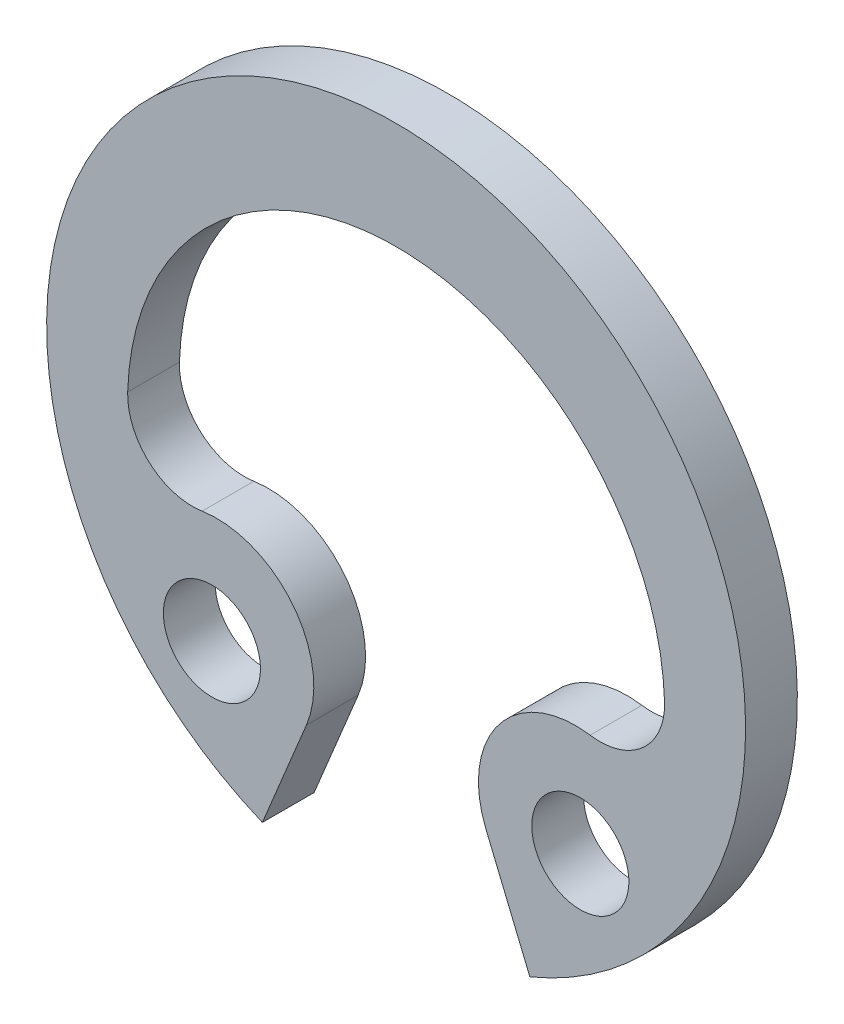
ISO-10303-21;
HEADER;
FILE_DESCRIPTION(('STEP AP214'),'2;1');
FILE_NAME('part.step','',(''),(''),'','','');
FILE_SCHEMA(('AUTOMOTIVE_DESIGN { 1 0 10303 214 1 1 1 1 }'));
ENDSEC;
DATA;
#1=APPLICATION_CONTEXT('core data for automotive mechanical design processes');
#2=APPLICATION_PROTOCOL_DEFINITION('international standard','automotive_design',2000,#1);
#3=PRODUCT_CONTEXT('',#1,'mechanical');
#4=PRODUCT('Part','Part','',(#3));
#5=PRODUCT_RELATED_PRODUCT_CATEGORY('part','',(#4));
#6=PRODUCT_DEFINITION_FORMATION('','',#4);
#7=PRODUCT_DEFINITION_CONTEXT('part definition',#1,'design');
#8=PRODUCT_DEFINITION('design','',#6,#7);
#9=PRODUCT_DEFINITION_SHAPE('','',#8);
#10=(LENGTH_UNIT() NAMED_UNIT(*) SI_UNIT(.MILLI.,.METRE.));
#11=(NAMED_UNIT(*) PLANE_ANGLE_UNIT() SI_UNIT($,.RADIAN.));
#12=(NAMED_UNIT(*) SI_UNIT($,.STERADIAN.) SOLID_ANGLE_UNIT());
#13=UNCERTAINTY_MEASURE_WITH_UNIT(LENGTH_MEASURE(1.E-05),#10,'distance_accuracy_value','');
#14=(GEOMETRIC_REPRESENTATION_CONTEXT(3) GLOBAL_UNCERTAINTY_ASSIGNED_CONTEXT((#13)) GLOBAL_UNIT_ASSIGNED_CONTEXT((#10,
#11,#12)) REPRESENTATION_CONTEXT('',''));
#15=CARTESIAN_POINT('',(0.,0.,0.));
#16=DIRECTION('',(0.,0.,1.));
#17=DIRECTION('',(1.,0.,0.));
#18=AXIS2_PLACEMENT_3D('',#15,#16,#17);
#19=CARTESIAN_POINT('',(-2.77176746072047,-2.77194970078665,0.8));
#20=DIRECTION('',(0.,0.,1.));
#21=DIRECTION('',(1.,0.,0.));
#22=AXIS2_PLACEMENT_3D('',#19,#20,#21);
#23=PLANE('',#22);
#24=CARTESIAN_POINT('',(-2.84604621023033,-2.95127446524947,0.8));
#25=DIRECTION('',(0.,0.,1.));
#26=DIRECTION('',(1.,0.,0.));
#27=AXIS2_PLACEMENT_3D('',#24,#25,#26);
#28=CIRCLE('',#27,0.75);
#29=CARTESIAN_POINT('',(-2.09604621023033,-2.95127446524947,0.8));
#30=VERTEX_POINT('',#29);
#31=EDGE_CURVE('E143',#30,#30,#28,.T.);
#32=ORIENTED_EDGE('',*,*,#31,.F.);
#33=EDGE_LOOP('',(#32));
#34=FACE_BOUND('',#33,.T.);
#35=CARTESIAN_POINT('',(-2.77176746072047,-2.77194970078665,0.8));
#36=DIRECTION('',(0.,0.,1.));
#37=DIRECTION('',(1.,0.,0.));
#38=AXIS2_PLACEMENT_3D('',#35,#36,#37);
#39=CIRCLE('',#38,1.5);
#40=CARTESIAN_POINT('',(-1.38594816195354,-3.34597484933429,0.8));
#41=VERTEX_POINT('',#40);
#42=CARTESIAN_POINT('',(-2.99776362474062,-1.2890721826321,0.8));
#43=VERTEX_POINT('',#42);
#44=EDGE_CURVE('E156',#41,#43,#39,.T.);
#45=ORIENTED_EDGE('',*,*,#44,.T.);
#46=CARTESIAN_POINT('',(-3.14842773408739,-0.300487170529072,0.8));
#47=DIRECTION('',(0.,0.,-1.));
#48=DIRECTION('',(-1.,0.,0.));
#49=AXIS2_PLACEMENT_3D('',#46,#47,#48);
#50=CIRCLE('',#49,1.);
#51=CARTESIAN_POINT('',(-4.14792860205164,-0.268895796093855,0.8));
#52=VERTEX_POINT('',#51);
#53=EDGE_CURVE('E102',#43,#52,#50,.T.);
#54=ORIENTED_EDGE('',*,*,#53,.T.);
#55=CARTESIAN_POINT('',(0.,-0.4,0.8));
#56=DIRECTION('',(0.,0.,-1.));
#57=DIRECTION('',(1.,0.,0.));
#58=AXIS2_PLACEMENT_3D('',#55,#56,#57);
#59=CIRCLE('',#58,4.15);
#60=CARTESIAN_POINT('',(4.14792860205165,-0.268895796093856,0.8));
#61=VERTEX_POINT('',#60);
#62=EDGE_CURVE('E171',#52,#61,#59,.T.);
#63=ORIENTED_EDGE('',*,*,#62,.T.);
#64=CARTESIAN_POINT('',(3.1484277340874,-0.300487170529072,0.8));
#65=DIRECTION('',(0.,0.,-1.));
#66=DIRECTION('',(1.,0.,0.));
#67=AXIS2_PLACEMENT_3D('',#64,#65,#66);
#68=CIRCLE('',#67,1.);
#69=CARTESIAN_POINT('',(2.99776362474063,-1.2890721826321,0.8));
#70=VERTEX_POINT('',#69);
#71=EDGE_CURVE('E184',#61,#70,#68,.T.);
#72=ORIENTED_EDGE('',*,*,#71,.T.);
#73=CARTESIAN_POINT('',(2.77176746072048,-2.77194970078665,0.8));
#74=DIRECTION('',(0.,0.,1.));
#75=DIRECTION('',(-1.,0.,0.));
#76=AXIS2_PLACEMENT_3D('',#73,#74,#75);
#77=CIRCLE('',#76,1.5);
#78=CARTESIAN_POINT('',(1.38594816195355,-3.34597484933429,0.8));
#79=VERTEX_POINT('',#78);
#80=EDGE_CURVE('E121',#70,#79,#77,.T.);
#81=ORIENTED_EDGE('',*,*,#80,.T.);
#82=DIRECTION('',(0.38268343236509,-0.923879532511287,0.));
#83=VECTOR('',#82,1.);
#84=CARTESIAN_POINT('',(1.38594816195355,-3.34597484933429,0.8));
#85=LINE('',#84,#83);
#86=CARTESIAN_POINT('',(2.0664905347715,-4.98894947556095,0.8));
#87=VERTEX_POINT('',#86);
#88=EDGE_CURVE('E115',#79,#87,#85,.T.);
#89=ORIENTED_EDGE('',*,*,#88,.T.);
#90=CARTESIAN_POINT('',(0.,0.,0.8));
#91=DIRECTION('',(0.,0.,1.));
#92=DIRECTION('',(1.,0.,0.));
#93=AXIS2_PLACEMENT_3D('',#90,#91,#92);
#94=CIRCLE('',#93,5.40000000000001);
#95=CARTESIAN_POINT('',(-2.06649053477149,-4.98894947556095,0.8));
#96=VERTEX_POINT('',#95);
#97=EDGE_CURVE('E119',#87,#96,#94,.T.);
#98=ORIENTED_EDGE('',*,*,#97,.T.);
#99=DIRECTION('',(0.38268343236509,0.923879532511287,0.));
#100=VECTOR('',#99,1.);
#101=CARTESIAN_POINT('',(-1.38594816195354,-3.34597484933429,0.8));
#102=LINE('',#101,#100);
#103=EDGE_CURVE('E59',#96,#41,#102,.T.);
#104=ORIENTED_EDGE('',*,*,#103,.T.);
#105=EDGE_LOOP('',(#45,#54,#63,#72,#81,#89,#98,#104));
#106=FACE_BOUND('',#105,.T.);
#107=CARTESIAN_POINT('',(2.84604621023034,-2.95127446524947,0.8));
#108=DIRECTION('',(0.,0.,1.));
#109=DIRECTION('',(-1.,0.,0.));
#110=AXIS2_PLACEMENT_3D('',#107,#108,#109);
#111=CIRCLE('',#110,0.75);
#112=CARTESIAN_POINT('',(2.09604621023034,-2.95127446524947,0.8));
#113=VERTEX_POINT('',#112);
#114=EDGE_CURVE('E194',#113,#113,#111,.T.);
#115=ORIENTED_EDGE('',*,*,#114,.F.);
#116=EDGE_LOOP('',(#115));
#117=FACE_BOUND('',#116,.T.);
#118=ADVANCED_FACE('F42',(#34,#106,#117),#23,.T.);
#119=CARTESIAN_POINT('',(-2.77176746072047,-2.77194970078665,0.));
#120=DIRECTION('',(0.,0.,1.));
#121=DIRECTION('',(1.,0.,0.));
#122=AXIS2_PLACEMENT_3D('',#119,#120,#121);
#123=PLANE('',#122);
#124=CARTESIAN_POINT('',(-2.77176746072047,-2.77194970078665,0.));
#125=DIRECTION('',(0.,0.,1.));
#126=DIRECTION('',(1.,0.,0.));
#127=AXIS2_PLACEMENT_3D('',#124,#125,#126);
#128=CIRCLE('',#127,1.5);
#129=CARTESIAN_POINT('',(-1.38594816195354,-3.34597484933429,0.));
#130=VERTEX_POINT('',#129);
#131=CARTESIAN_POINT('',(-2.99776362474062,-1.2890721826321,0.));
#132=VERTEX_POINT('',#131);
#133=EDGE_CURVE('E139',#130,#132,#128,.T.);
#134=ORIENTED_EDGE('',*,*,#133,.F.);
#135=DIRECTION('',(0.38268343236509,0.923879532511287,0.));
#136=VECTOR('',#135,1.);
#137=CARTESIAN_POINT('',(-1.38594816195354,-3.34597484933429,0.));
#138=LINE('',#137,#136);
#139=CARTESIAN_POINT('',(-2.06649053477149,-4.98894947556095,0.));
#140=VERTEX_POINT('',#139);
#141=EDGE_CURVE('E94',#140,#130,#138,.T.);
#142=ORIENTED_EDGE('',*,*,#141,.F.);
#143=CARTESIAN_POINT('',(0.,0.,0.));
#144=DIRECTION('',(0.,0.,1.));
#145=DIRECTION('',(1.,0.,0.));
#146=AXIS2_PLACEMENT_3D('',#143,#144,#145);
#147=CIRCLE('',#146,5.40000000000001);
#148=CARTESIAN_POINT('',(2.0664905347715,-4.98894947556095,0.));
#149=VERTEX_POINT('',#148);
#150=EDGE_CURVE('E88',#149,#140,#147,.T.);
#151=ORIENTED_EDGE('',*,*,#150,.F.);
#152=DIRECTION('',(0.38268343236509,-0.923879532511287,0.));
#153=VECTOR('',#152,1.);
#154=CARTESIAN_POINT('',(1.38594816195355,-3.34597484933429,0.));
#155=LINE('',#154,#153);
#156=CARTESIAN_POINT('',(1.38594816195355,-3.34597484933429,0.));
#157=VERTEX_POINT('',#156);
#158=EDGE_CURVE('E129',#157,#149,#155,.T.);
#159=ORIENTED_EDGE('',*,*,#158,.F.);
#160=CARTESIAN_POINT('',(2.77176746072048,-2.77194970078665,0.));
#161=DIRECTION('',(0.,0.,1.));
#162=DIRECTION('',(-1.,0.,0.));
#163=AXIS2_PLACEMENT_3D('',#160,#161,#162);
#164=CIRCLE('',#163,1.5);
#165=CARTESIAN_POINT('',(2.99776362474063,-1.2890721826321,0.));
#166=VERTEX_POINT('',#165);
#167=EDGE_CURVE('E150',#166,#157,#164,.T.);
#168=ORIENTED_EDGE('',*,*,#167,.F.);
#169=CARTESIAN_POINT('',(3.1484277340874,-0.300487170529072,0.));
#170=DIRECTION('',(0.,0.,-1.));
#171=DIRECTION('',(1.,0.,0.));
#172=AXIS2_PLACEMENT_3D('',#169,#170,#171);
#173=CIRCLE('',#172,1.);
#174=CARTESIAN_POINT('',(4.14792860205165,-0.268895796093856,0.));
#175=VERTEX_POINT('',#174);
#176=EDGE_CURVE('E148',#175,#166,#173,.T.);
#177=ORIENTED_EDGE('',*,*,#176,.F.);
#178=CARTESIAN_POINT('',(0.,-0.4,0.));
#179=DIRECTION('',(0.,0.,-1.));
#180=DIRECTION('',(1.,0.,0.));
#181=AXIS2_PLACEMENT_3D('',#178,#179,#180);
#182=CIRCLE('',#181,4.15);
#183=CARTESIAN_POINT('',(-4.14792860205164,-0.268895796093855,0.));
#184=VERTEX_POINT('',#183);
#185=EDGE_CURVE('E145',#184,#175,#182,.T.);
#186=ORIENTED_EDGE('',*,*,#185,.F.);
#187=CARTESIAN_POINT('',(-3.14842773408739,-0.300487170529072,0.));
#188=DIRECTION('',(0.,0.,-1.));
#189=DIRECTION('',(-1.,0.,0.));
#190=AXIS2_PLACEMENT_3D('',#187,#188,#189);
#191=CIRCLE('',#190,1.);
#192=EDGE_CURVE('E142',#132,#184,#191,.T.);
#193=ORIENTED_EDGE('',*,*,#192,.F.);
#194=EDGE_LOOP('',(#134,#142,#151,#159,#168,#177,#186,#193));
#195=FACE_BOUND('',#194,.T.);
#196=CARTESIAN_POINT('',(-2.84604621023033,-2.95127446524947,0.));
#197=DIRECTION('',(0.,0.,1.));
#198=DIRECTION('',(1.,0.,0.));
#199=AXIS2_PLACEMENT_3D('',#196,#197,#198);
#200=CIRCLE('',#199,0.75);
#201=CARTESIAN_POINT('',(-2.09604621023033,-2.95127446524947,0.));
#202=VERTEX_POINT('',#201);
#203=EDGE_CURVE('E191',#202,#202,#200,.T.);
#204=ORIENTED_EDGE('',*,*,#203,.T.);
#205=EDGE_LOOP('',(#204));
#206=FACE_BOUND('',#205,.T.);
#207=CARTESIAN_POINT('',(2.84604621023034,-2.95127446524947,0.));
#208=DIRECTION('',(0.,0.,1.));
#209=DIRECTION('',(-1.,0.,0.));
#210=AXIS2_PLACEMENT_3D('',#207,#208,#209);
#211=CIRCLE('',#210,0.75);
#212=CARTESIAN_POINT('',(2.09604621023034,-2.95127446524947,0.));
#213=VERTEX_POINT('',#212);
#214=EDGE_CURVE('E197',#213,#213,#211,.T.);
#215=ORIENTED_EDGE('',*,*,#214,.T.);
#216=EDGE_LOOP('',(#215));
#217=FACE_BOUND('',#216,.T.);
#218=ADVANCED_FACE('F175',(#195,#206,#217),#123,.F.);
#219=CARTESIAN_POINT('',(-2.77176746072047,-2.77194970078665,0.8));
#220=DIRECTION('',(0.,0.,-1.));
#221=DIRECTION('',(-1.,0.,0.));
#222=AXIS2_PLACEMENT_3D('',#219,#220,#221);
#223=CYLINDRICAL_SURFACE('',#222,1.5);
#224=ORIENTED_EDGE('',*,*,#133,.T.);
#225=DIRECTION('',(0.,0.,-1.));
#226=VECTOR('',#225,1.);
#227=CARTESIAN_POINT('',(-2.99776362474062,-1.2890721826321,0.8));
#228=LINE('',#227,#226);
#229=EDGE_CURVE('E11',#43,#132,#228,.T.);
#230=ORIENTED_EDGE('',*,*,#229,.F.);
#231=ORIENTED_EDGE('',*,*,#44,.F.);
#232=DIRECTION('',(0.,0.,-1.));
#233=VECTOR('',#232,1.);
#234=CARTESIAN_POINT('',(-1.38594816195354,-3.34597484933429,0.8));
#235=LINE('',#234,#233);
#236=EDGE_CURVE('E135',#41,#130,#235,.T.);
#237=ORIENTED_EDGE('',*,*,#236,.T.);
#238=EDGE_LOOP('',(#224,#230,#231,#237));
#239=FACE_BOUND('',#238,.T.);
#240=ADVANCED_FACE('F44',(#239),#223,.T.);
#241=CARTESIAN_POINT('',(-3.14842773408739,-0.300487170529072,0.8));
#242=DIRECTION('',(0.,0.,-1.));
#243=DIRECTION('',(-1.,0.,0.));
#244=AXIS2_PLACEMENT_3D('',#241,#242,#243);
#245=CYLINDRICAL_SURFACE('',#244,1.);
#246=ORIENTED_EDGE('',*,*,#192,.T.);
#247=DIRECTION('',(0.,0.,-1.));
#248=VECTOR('',#247,1.);
#249=CARTESIAN_POINT('',(-4.14792860205164,-0.268895796093855,0.8));
#250=LINE('',#249,#248);
#251=EDGE_CURVE('E51',#52,#184,#250,.T.);
#252=ORIENTED_EDGE('',*,*,#251,.F.);
#253=ORIENTED_EDGE('',*,*,#53,.F.);
#254=ORIENTED_EDGE('',*,*,#229,.T.);
#255=EDGE_LOOP('',(#246,#252,#253,#254));
#256=FACE_BOUND('',#255,.T.);
#257=ADVANCED_FACE('F229',(#256),#245,.F.);
#258=CARTESIAN_POINT('',(0.,-0.4,0.8));
#259=DIRECTION('',(0.,0.,-1.));
#260=DIRECTION('',(-1.,0.,0.));
#261=AXIS2_PLACEMENT_3D('',#258,#259,#260);
#262=CYLINDRICAL_SURFACE('',#261,4.15);
#263=ORIENTED_EDGE('',*,*,#185,.T.);
#264=DIRECTION('',(0.,0.,-1.));
#265=VECTOR('',#264,1.);
#266=CARTESIAN_POINT('',(4.14792860205165,-0.268895796093856,0.8));
#267=LINE('',#266,#265);
#268=EDGE_CURVE('E163',#61,#175,#267,.T.);
#269=ORIENTED_EDGE('',*,*,#268,.F.);
#270=ORIENTED_EDGE('',*,*,#62,.F.);
#271=ORIENTED_EDGE('',*,*,#251,.T.);
#272=EDGE_LOOP('',(#263,#269,#270,#271));
#273=FACE_BOUND('',#272,.T.);
#274=ADVANCED_FACE('F169',(#273),#262,.F.);
#275=CARTESIAN_POINT('',(3.1484277340874,-0.300487170529072,0.8));
#276=DIRECTION('',(0.,0.,-1.));
#277=DIRECTION('',(-1.,0.,0.));
#278=AXIS2_PLACEMENT_3D('',#275,#276,#277);
#279=CYLINDRICAL_SURFACE('',#278,1.);
#280=ORIENTED_EDGE('',*,*,#176,.T.);
#281=DIRECTION('',(0.,0.,-1.));
#282=VECTOR('',#281,1.);
#283=CARTESIAN_POINT('',(2.99776362474063,-1.2890721826321,0.8));
#284=LINE('',#283,#282);
#285=EDGE_CURVE('E160',#70,#166,#284,.T.);
#286=ORIENTED_EDGE('',*,*,#285,.F.);
#287=ORIENTED_EDGE('',*,*,#71,.F.);
#288=ORIENTED_EDGE('',*,*,#268,.T.);
#289=EDGE_LOOP('',(#280,#286,#287,#288));
#290=FACE_BOUND('',#289,.T.);
#291=ADVANCED_FACE('F180',(#290),#279,.F.);
#292=CARTESIAN_POINT('',(2.77176746072048,-2.77194970078665,0.8));
#293=DIRECTION('',(0.,0.,-1.));
#294=DIRECTION('',(-1.,0.,0.));
#295=AXIS2_PLACEMENT_3D('',#292,#293,#294);
#296=CYLINDRICAL_SURFACE('',#295,1.5);
#297=ORIENTED_EDGE('',*,*,#167,.T.);
#298=DIRECTION('',(0.,0.,-1.));
#299=VECTOR('',#298,1.);
#300=CARTESIAN_POINT('',(1.38594816195355,-3.34597484933429,0.8));
#301=LINE('',#300,#299);
#302=EDGE_CURVE('E130',#79,#157,#301,.T.);
#303=ORIENTED_EDGE('',*,*,#302,.F.);
#304=ORIENTED_EDGE('',*,*,#80,.F.);
#305=ORIENTED_EDGE('',*,*,#285,.T.);
#306=EDGE_LOOP('',(#297,#303,#304,#305));
#307=FACE_BOUND('',#306,.T.);
#308=ADVANCED_FACE('F183',(#307),#296,.T.);
#309=CARTESIAN_POINT('',(1.38594816195355,-3.34597484933429,0.8));
#310=DIRECTION('',(0.923879532511287,0.38268343236509,0.));
#311=DIRECTION('',(-0.38268343236509,0.923879532511287,0.));
#312=AXIS2_PLACEMENT_3D('',#309,#310,#311);
#313=PLANE('',#312);
#314=ORIENTED_EDGE('',*,*,#158,.T.);
#315=DIRECTION('',(0.,0.,-1.));
#316=VECTOR('',#315,1.);
#317=CARTESIAN_POINT('',(2.0664905347715,-4.98894947556095,0.8));
#318=LINE('',#317,#316);
#319=EDGE_CURVE('E126',#87,#149,#318,.T.);
#320=ORIENTED_EDGE('',*,*,#319,.F.);
#321=ORIENTED_EDGE('',*,*,#88,.F.);
#322=ORIENTED_EDGE('',*,*,#302,.T.);
#323=EDGE_LOOP('',(#314,#320,#321,#322));
#324=FACE_BOUND('',#323,.T.);
#325=ADVANCED_FACE('F127',(#324),#313,.F.);
#326=CARTESIAN_POINT('',(0.,0.,0.8));
#327=DIRECTION('',(0.,0.,-1.));
#328=DIRECTION('',(-1.,0.,0.));
#329=AXIS2_PLACEMENT_3D('',#326,#327,#328);
#330=CYLINDRICAL_SURFACE('',#329,5.40000000000001);
#331=ORIENTED_EDGE('',*,*,#150,.T.);
#332=DIRECTION('',(0.,0.,-1.));
#333=VECTOR('',#332,1.);
#334=CARTESIAN_POINT('',(-2.06649053477149,-4.98894947556095,0.8));
#335=LINE('',#334,#333);
#336=EDGE_CURVE('E131',#96,#140,#335,.T.);
#337=ORIENTED_EDGE('',*,*,#336,.F.);
#338=ORIENTED_EDGE('',*,*,#97,.F.);
#339=ORIENTED_EDGE('',*,*,#319,.T.);
#340=EDGE_LOOP('',(#331,#337,#338,#339));
#341=FACE_BOUND('',#340,.T.);
#342=ADVANCED_FACE('F133',(#341),#330,.T.);
#343=CARTESIAN_POINT('',(-1.38594816195354,-3.34597484933429,0.8));
#344=DIRECTION('',(-0.923879532511287,0.38268343236509,0.));
#345=DIRECTION('',(-0.38268343236509,-0.923879532511287,0.));
#346=AXIS2_PLACEMENT_3D('',#343,#344,#345);
#347=PLANE('',#346);
#348=ORIENTED_EDGE('',*,*,#141,.T.);
#349=ORIENTED_EDGE('',*,*,#236,.F.);
#350=ORIENTED_EDGE('',*,*,#103,.F.);
#351=ORIENTED_EDGE('',*,*,#336,.T.);
#352=EDGE_LOOP('',(#348,#349,#350,#351));
#353=FACE_BOUND('',#352,.T.);
#354=ADVANCED_FACE('F217',(#353),#347,.F.);
#355=CARTESIAN_POINT('',(-2.84604621023033,-2.95127446524947,0.8));
#356=DIRECTION('',(0.,0.,-1.));
#357=DIRECTION('',(-1.,0.,0.));
#358=AXIS2_PLACEMENT_3D('',#355,#356,#357);
#359=CYLINDRICAL_SURFACE('',#358,0.75);
#360=ORIENTED_EDGE('',*,*,#31,.T.);
#361=EDGE_LOOP('',(#360));
#362=FACE_BOUND('',#361,.T.);
#363=ORIENTED_EDGE('',*,*,#203,.F.);
#364=EDGE_LOOP('',(#363));
#365=FACE_BOUND('',#364,.T.);
#366=ADVANCED_FACE('F214',(#362,#365),#359,.F.);
#367=CARTESIAN_POINT('',(2.84604621023034,-2.95127446524947,0.8));
#368=DIRECTION('',(0.,0.,-1.));
#369=DIRECTION('',(-1.,0.,0.));
#370=AXIS2_PLACEMENT_3D('',#367,#368,#369);
#371=CYLINDRICAL_SURFACE('',#370,0.75);
#372=ORIENTED_EDGE('',*,*,#114,.T.);
#373=EDGE_LOOP('',(#372));
#374=FACE_BOUND('',#373,.T.);
#375=ORIENTED_EDGE('',*,*,#214,.F.);
#376=EDGE_LOOP('',(#375));
#377=FACE_BOUND('',#376,.T.);
#378=ADVANCED_FACE('F203',(#374,#377),#371,.F.);
#379=CLOSED_SHELL('',(#118,#218,#240,#257,#274,#291,#308,#325,#342,#354,#366,#378));
#380=MANIFOLD_SOLID_BREP('B2',#379);
#381=ADVANCED_BREP_SHAPE_REPRESENTATION('',(#18,#380),#14);
#382=SHAPE_DEFINITION_REPRESENTATION(#9,#381);
ENDSEC;
END-ISO-10303-21;
